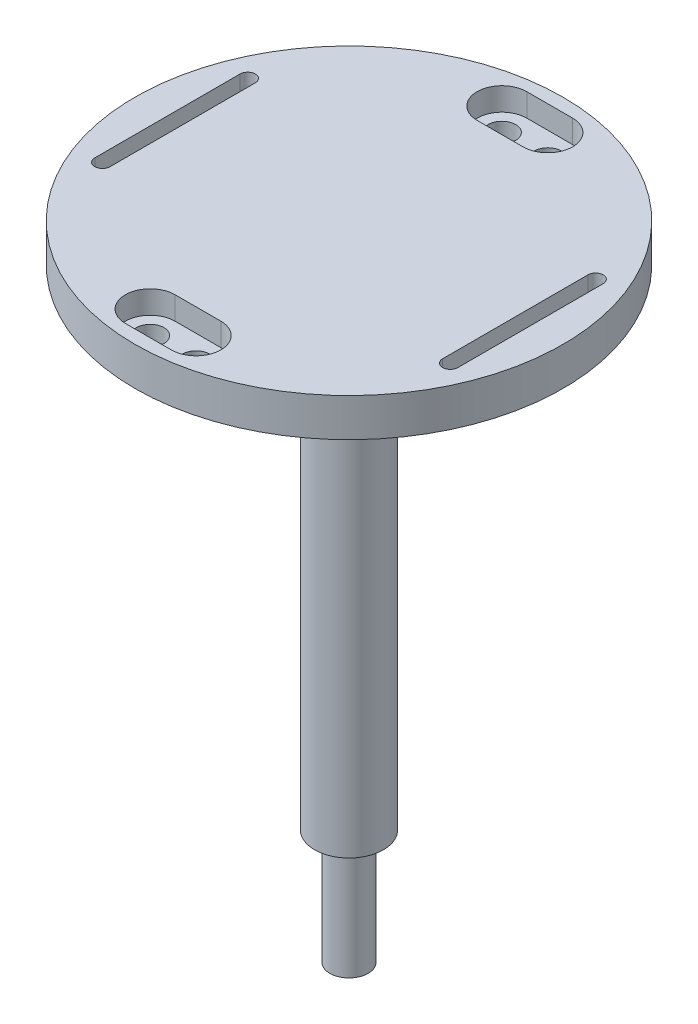
ISO-10303-21;
HEADER;
FILE_DESCRIPTION(('STEP AP214'),'2;1');
FILE_NAME('part.step','',(''),(''),'','','');
FILE_SCHEMA(('AUTOMOTIVE_DESIGN { 1 0 10303 214 1 1 1 1 }'));
ENDSEC;
DATA;
#1=APPLICATION_CONTEXT('core data for automotive mechanical design processes');
#2=APPLICATION_PROTOCOL_DEFINITION('international standard','automotive_design',2000,#1);
#3=PRODUCT_CONTEXT('',#1,'mechanical');
#4=PRODUCT('Part','Part','',(#3));
#5=PRODUCT_RELATED_PRODUCT_CATEGORY('part','',(#4));
#6=PRODUCT_DEFINITION_FORMATION('','',#4);
#7=PRODUCT_DEFINITION_CONTEXT('part definition',#1,'design');
#8=PRODUCT_DEFINITION('design','',#6,#7);
#9=PRODUCT_DEFINITION_SHAPE('','',#8);
#10=(LENGTH_UNIT() NAMED_UNIT(*) SI_UNIT(.MILLI.,.METRE.));
#11=(NAMED_UNIT(*) PLANE_ANGLE_UNIT() SI_UNIT($,.RADIAN.));
#12=(NAMED_UNIT(*) SI_UNIT($,.STERADIAN.) SOLID_ANGLE_UNIT());
#13=UNCERTAINTY_MEASURE_WITH_UNIT(LENGTH_MEASURE(1.E-05),#10,'distance_accuracy_value','');
#14=(GEOMETRIC_REPRESENTATION_CONTEXT(3) GLOBAL_UNCERTAINTY_ASSIGNED_CONTEXT((#13)) GLOBAL_UNIT_ASSIGNED_CONTEXT((#10,
#11,#12)) REPRESENTATION_CONTEXT('',''));
#15=CARTESIAN_POINT('',(0.,0.,0.));
#16=DIRECTION('',(0.,0.,1.));
#17=DIRECTION('',(1.,0.,0.));
#18=AXIS2_PLACEMENT_3D('',#15,#16,#17);
#19=CARTESIAN_POINT('',(0.,83.999999926,0.));
#20=DIRECTION('',(0.,1.,0.));
#21=DIRECTION('',(0.,0.,1.));
#22=AXIS2_PLACEMENT_3D('',#19,#20,#21);
#23=PLANE('',#22);
#24=CARTESIAN_POINT('',(-22.75,83.999999926,9.5));
#25=DIRECTION('',(0.,1.,0.));
#26=DIRECTION('',(0.,0.,1.));
#27=AXIS2_PLACEMENT_3D('',#24,#25,#26);
#28=CIRCLE('',#27,1.);
#29=CARTESIAN_POINT('',(-23.75,83.999999926,9.5));
#30=VERTEX_POINT('',#29);
#31=CARTESIAN_POINT('',(-21.75,83.999999926,9.5));
#32=VERTEX_POINT('',#31);
#33=EDGE_CURVE('E180',#30,#32,#28,.T.);
#34=ORIENTED_EDGE('',*,*,#33,.F.);
#35=DIRECTION('',(0.,0.,1.));
#36=VECTOR('',#35,1.);
#37=CARTESIAN_POINT('',(-23.75,83.999999926,9.5));
#38=LINE('',#37,#36);
#39=CARTESIAN_POINT('',(-23.75,83.999999926,-9.5));
#40=VERTEX_POINT('',#39);
#41=EDGE_CURVE('E195',#40,#30,#38,.T.);
#42=ORIENTED_EDGE('',*,*,#41,.F.);
#43=CARTESIAN_POINT('',(-22.75,83.999999926,-9.5));
#44=DIRECTION('',(0.,1.,0.));
#45=DIRECTION('',(0.,0.,1.));
#46=AXIS2_PLACEMENT_3D('',#43,#44,#45);
#47=CIRCLE('',#46,1.);
#48=CARTESIAN_POINT('',(-21.75,83.999999926,-9.5));
#49=VERTEX_POINT('',#48);
#50=EDGE_CURVE('E191',#49,#40,#47,.T.);
#51=ORIENTED_EDGE('',*,*,#50,.F.);
#52=DIRECTION('',(0.,0.,-1.));
#53=VECTOR('',#52,1.);
#54=CARTESIAN_POINT('',(-21.75,83.999999926,9.5));
#55=LINE('',#54,#53);
#56=EDGE_CURVE('E187',#32,#49,#55,.T.);
#57=ORIENTED_EDGE('',*,*,#56,.F.);
#58=EDGE_LOOP('',(#34,#42,#51,#57));
#59=FACE_BOUND('',#58,.T.);
#60=CARTESIAN_POINT('',(0.,83.999999926,0.));
#61=DIRECTION('',(0.,-1.,0.));
#62=DIRECTION('',(0.,0.,-1.));
#63=AXIS2_PLACEMENT_3D('',#60,#61,#62);
#64=CIRCLE('',#63,28.);
#65=CARTESIAN_POINT('',(0.,83.999999926,-28.));
#66=VERTEX_POINT('',#65);
#67=EDGE_CURVE('E348',#66,#66,#64,.T.);
#68=ORIENTED_EDGE('',*,*,#67,.F.);
#69=EDGE_LOOP('',(#68));
#70=FACE_BOUND('',#69,.T.);
#71=CARTESIAN_POINT('',(3.,83.999999926,23.));
#72=DIRECTION('',(0.,1.,0.));
#73=DIRECTION('',(0.,0.,1.));
#74=AXIS2_PLACEMENT_3D('',#71,#72,#73);
#75=CIRCLE('',#74,3.25);
#76=CARTESIAN_POINT('',(3.,83.999999926,26.25));
#77=VERTEX_POINT('',#76);
#78=CARTESIAN_POINT('',(3.,83.999999926,19.75));
#79=VERTEX_POINT('',#78);
#80=EDGE_CURVE('E307',#77,#79,#75,.T.);
#81=ORIENTED_EDGE('',*,*,#80,.F.);
#82=DIRECTION('',(1.,0.,0.));
#83=VECTOR('',#82,1.);
#84=CARTESIAN_POINT('',(-3.,83.999999926,26.25));
#85=LINE('',#84,#83);
#86=CARTESIAN_POINT('',(-3.,83.999999926,26.25));
#87=VERTEX_POINT('',#86);
#88=EDGE_CURVE('E243',#87,#77,#85,.T.);
#89=ORIENTED_EDGE('',*,*,#88,.F.);
#90=CARTESIAN_POINT('',(-3.,83.999999926,23.));
#91=DIRECTION('',(0.,1.,0.));
#92=DIRECTION('',(0.,0.,1.));
#93=AXIS2_PLACEMENT_3D('',#90,#91,#92);
#94=CIRCLE('',#93,3.25);
#95=CARTESIAN_POINT('',(-3.,83.999999926,19.75));
#96=VERTEX_POINT('',#95);
#97=EDGE_CURVE('E294',#96,#87,#94,.T.);
#98=ORIENTED_EDGE('',*,*,#97,.F.);
#99=DIRECTION('',(-1.,0.,0.));
#100=VECTOR('',#99,1.);
#101=CARTESIAN_POINT('',(-3.,83.999999926,19.75));
#102=LINE('',#101,#100);
#103=EDGE_CURVE('E246',#79,#96,#102,.T.);
#104=ORIENTED_EDGE('',*,*,#103,.F.);
#105=EDGE_LOOP('',(#81,#89,#98,#104));
#106=FACE_BOUND('',#105,.T.);
#107=CARTESIAN_POINT('',(3.,83.999999926,-23.));
#108=DIRECTION('',(0.,1.,0.));
#109=DIRECTION('',(0.,0.,1.));
#110=AXIS2_PLACEMENT_3D('',#107,#108,#109);
#111=CIRCLE('',#110,3.25);
#112=CARTESIAN_POINT('',(3.,83.999999926,-19.75));
#113=VERTEX_POINT('',#112);
#114=CARTESIAN_POINT('',(3.,83.999999926,-26.25));
#115=VERTEX_POINT('',#114);
#116=EDGE_CURVE('E242',#113,#115,#111,.T.);
#117=ORIENTED_EDGE('',*,*,#116,.F.);
#118=DIRECTION('',(1.,0.,0.));
#119=VECTOR('',#118,1.);
#120=CARTESIAN_POINT('',(-3.,83.999999926,-19.75));
#121=LINE('',#120,#119);
#122=CARTESIAN_POINT('',(-3.,83.999999926,-19.75));
#123=VERTEX_POINT('',#122);
#124=EDGE_CURVE('E213',#123,#113,#121,.T.);
#125=ORIENTED_EDGE('',*,*,#124,.F.);
#126=CARTESIAN_POINT('',(-3.,83.999999926,-23.));
#127=DIRECTION('',(0.,1.,0.));
#128=DIRECTION('',(0.,0.,1.));
#129=AXIS2_PLACEMENT_3D('',#126,#127,#128);
#130=CIRCLE('',#129,3.25);
#131=CARTESIAN_POINT('',(-3.,83.999999926,-26.25));
#132=VERTEX_POINT('',#131);
#133=EDGE_CURVE('E281',#132,#123,#130,.T.);
#134=ORIENTED_EDGE('',*,*,#133,.F.);
#135=DIRECTION('',(-1.,0.,0.));
#136=VECTOR('',#135,1.);
#137=CARTESIAN_POINT('',(-3.,83.999999926,-26.25));
#138=LINE('',#137,#136);
#139=EDGE_CURVE('E216',#115,#132,#138,.T.);
#140=ORIENTED_EDGE('',*,*,#139,.F.);
#141=EDGE_LOOP('',(#117,#125,#134,#140));
#142=FACE_BOUND('',#141,.T.);
#143=DIRECTION('',(0.,0.,1.));
#144=VECTOR('',#143,1.);
#145=CARTESIAN_POINT('',(23.75,83.999999926,9.5));
#146=LINE('',#145,#144);
#147=CARTESIAN_POINT('',(23.75,83.999999926,-9.5));
#148=VERTEX_POINT('',#147);
#149=CARTESIAN_POINT('',(23.75,83.999999926,9.5));
#150=VERTEX_POINT('',#149);
#151=EDGE_CURVE('E164',#148,#150,#146,.T.);
#152=ORIENTED_EDGE('',*,*,#151,.T.);
#153=CARTESIAN_POINT('',(22.75,83.999999926,9.5));
#154=DIRECTION('',(0.,-1.,0.));
#155=DIRECTION('',(0.,0.,1.));
#156=AXIS2_PLACEMENT_3D('',#153,#154,#155);
#157=CIRCLE('',#156,1.);
#158=CARTESIAN_POINT('',(21.75,83.999999926,9.5));
#159=VERTEX_POINT('',#158);
#160=EDGE_CURVE('E53',#150,#159,#157,.T.);
#161=ORIENTED_EDGE('',*,*,#160,.T.);
#162=DIRECTION('',(0.,0.,-1.));
#163=VECTOR('',#162,1.);
#164=CARTESIAN_POINT('',(21.75,83.999999926,9.5));
#165=LINE('',#164,#163);
#166=CARTESIAN_POINT('',(21.75,83.999999926,-9.5));
#167=VERTEX_POINT('',#166);
#168=EDGE_CURVE('E170',#159,#167,#165,.T.);
#169=ORIENTED_EDGE('',*,*,#168,.T.);
#170=CARTESIAN_POINT('',(22.75,83.999999926,-9.5));
#171=DIRECTION('',(0.,-1.,0.));
#172=DIRECTION('',(0.,0.,1.));
#173=AXIS2_PLACEMENT_3D('',#170,#171,#172);
#174=CIRCLE('',#173,1.);
#175=EDGE_CURVE('E154',#167,#148,#174,.T.);
#176=ORIENTED_EDGE('',*,*,#175,.T.);
#177=EDGE_LOOP('',(#152,#161,#169,#176));
#178=FACE_BOUND('',#177,.T.);
#179=ADVANCED_FACE('F38',(#59,#70,#106,#142,#178),#23,.T.);
#180=CARTESIAN_POINT('',(28.,78.999999926,0.));
#181=DIRECTION('',(0.,-1.,0.));
#182=DIRECTION('',(0.,0.,-1.));
#183=AXIS2_PLACEMENT_3D('',#180,#181,#182);
#184=PLANE('',#183);
#185=CARTESIAN_POINT('',(-22.75,78.999999926,9.5));
#186=DIRECTION('',(0.,-1.,0.));
#187=DIRECTION('',(0.,0.,-1.));
#188=AXIS2_PLACEMENT_3D('',#185,#186,#187);
#189=CIRCLE('',#188,1.);
#190=CARTESIAN_POINT('',(-21.75,78.999999926,9.5));
#191=VERTEX_POINT('',#190);
#192=CARTESIAN_POINT('',(-23.75,78.999999926,9.5));
#193=VERTEX_POINT('',#192);
#194=EDGE_CURVE('E374',#191,#193,#189,.T.);
#195=ORIENTED_EDGE('',*,*,#194,.F.);
#196=DIRECTION('',(0.,0.,1.));
#197=VECTOR('',#196,1.);
#198=CARTESIAN_POINT('',(-21.75,78.999999926,0.));
#199=LINE('',#198,#197);
#200=CARTESIAN_POINT('',(-21.75,78.999999926,-9.5));
#201=VERTEX_POINT('',#200);
#202=EDGE_CURVE('E352',#201,#191,#199,.T.);
#203=ORIENTED_EDGE('',*,*,#202,.F.);
#204=CARTESIAN_POINT('',(-22.75,78.999999926,-9.5));
#205=DIRECTION('',(0.,-1.,0.));
#206=DIRECTION('',(0.,0.,-1.));
#207=AXIS2_PLACEMENT_3D('',#204,#205,#206);
#208=CIRCLE('',#207,1.);
#209=CARTESIAN_POINT('',(-23.75,78.999999926,-9.5));
#210=VERTEX_POINT('',#209);
#211=EDGE_CURVE('E367',#210,#201,#208,.T.);
#212=ORIENTED_EDGE('',*,*,#211,.F.);
#213=DIRECTION('',(0.,0.,-1.));
#214=VECTOR('',#213,1.);
#215=CARTESIAN_POINT('',(-23.75,78.999999926,0.));
#216=LINE('',#215,#214);
#217=EDGE_CURVE('E371',#193,#210,#216,.T.);
#218=ORIENTED_EDGE('',*,*,#217,.F.);
#219=EDGE_LOOP('',(#195,#203,#212,#218));
#220=FACE_BOUND('',#219,.T.);
#221=CARTESIAN_POINT('',(3.,78.999999926,-23.));
#222=DIRECTION('',(0.,-1.,0.));
#223=DIRECTION('',(0.,0.,-1.));
#224=AXIS2_PLACEMENT_3D('',#221,#222,#223);
#225=CIRCLE('',#224,1.8);
#226=CARTESIAN_POINT('',(3.,78.999999926,-24.8));
#227=VERTEX_POINT('',#226);
#228=EDGE_CURVE('E280',#227,#227,#225,.T.);
#229=ORIENTED_EDGE('',*,*,#228,.F.);
#230=EDGE_LOOP('',(#229));
#231=FACE_BOUND('',#230,.T.);
#232=CARTESIAN_POINT('',(-3.,78.999999926,-23.));
#233=DIRECTION('',(0.,-1.,0.));
#234=DIRECTION('',(0.,0.,-1.));
#235=AXIS2_PLACEMENT_3D('',#232,#233,#234);
#236=CIRCLE('',#235,1.8);
#237=CARTESIAN_POINT('',(-3.,78.999999926,-24.8));
#238=VERTEX_POINT('',#237);
#239=EDGE_CURVE('E293',#238,#238,#236,.T.);
#240=ORIENTED_EDGE('',*,*,#239,.F.);
#241=EDGE_LOOP('',(#240));
#242=FACE_BOUND('',#241,.T.);
#243=CARTESIAN_POINT('',(-3.,78.999999926,23.));
#244=DIRECTION('',(0.,-1.,0.));
#245=DIRECTION('',(0.,0.,-1.));
#246=AXIS2_PLACEMENT_3D('',#243,#244,#245);
#247=CIRCLE('',#246,1.8);
#248=CARTESIAN_POINT('',(-3.,78.999999926,21.2));
#249=VERTEX_POINT('',#248);
#250=EDGE_CURVE('E306',#249,#249,#247,.T.);
#251=ORIENTED_EDGE('',*,*,#250,.F.);
#252=EDGE_LOOP('',(#251));
#253=FACE_BOUND('',#252,.T.);
#254=CARTESIAN_POINT('',(3.,78.999999926,23.));
#255=DIRECTION('',(0.,-1.,0.));
#256=DIRECTION('',(0.,0.,-1.));
#257=AXIS2_PLACEMENT_3D('',#254,#255,#256);
#258=CIRCLE('',#257,1.8);
#259=CARTESIAN_POINT('',(3.,78.999999926,21.2));
#260=VERTEX_POINT('',#259);
#261=EDGE_CURVE('E319',#260,#260,#258,.T.);
#262=ORIENTED_EDGE('',*,*,#261,.F.);
#263=EDGE_LOOP('',(#262));
#264=FACE_BOUND('',#263,.T.);
#265=CARTESIAN_POINT('',(0.,78.999999926,0.));
#266=DIRECTION('',(0.,-1.,0.));
#267=DIRECTION('',(0.,0.,-1.));
#268=AXIS2_PLACEMENT_3D('',#265,#266,#267);
#269=CIRCLE('',#268,28.);
#270=CARTESIAN_POINT('',(0.,78.999999926,-28.));
#271=VERTEX_POINT('',#270);
#272=EDGE_CURVE('E344',#271,#271,#269,.T.);
#273=ORIENTED_EDGE('',*,*,#272,.T.);
#274=EDGE_LOOP('',(#273));
#275=FACE_BOUND('',#274,.T.);
#276=CARTESIAN_POINT('',(0.,78.999999926,0.));
#277=DIRECTION('',(0.,-1.,0.));
#278=DIRECTION('',(0.,0.,-1.));
#279=AXIS2_PLACEMENT_3D('',#276,#277,#278);
#280=CIRCLE('',#279,15.);
#281=CARTESIAN_POINT('',(0.,78.999999926,-15.));
#282=VERTEX_POINT('',#281);
#283=EDGE_CURVE('E340',#282,#282,#280,.T.);
#284=ORIENTED_EDGE('',*,*,#283,.F.);
#285=EDGE_LOOP('',(#284));
#286=FACE_BOUND('',#285,.T.);
#287=DIRECTION('',(0.,0.,1.));
#288=VECTOR('',#287,1.);
#289=CARTESIAN_POINT('',(21.75,78.999999926,0.));
#290=LINE('',#289,#288);
#291=CARTESIAN_POINT('',(21.75,78.999999926,-9.5));
#292=VERTEX_POINT('',#291);
#293=CARTESIAN_POINT('',(21.75,78.999999926,9.5));
#294=VERTEX_POINT('',#293);
#295=EDGE_CURVE('E46',#292,#294,#290,.T.);
#296=ORIENTED_EDGE('',*,*,#295,.T.);
#297=CARTESIAN_POINT('',(22.75,78.999999926,9.5));
#298=DIRECTION('',(0.,-1.,0.));
#299=DIRECTION('',(0.,0.,-1.));
#300=AXIS2_PLACEMENT_3D('',#297,#298,#299);
#301=CIRCLE('',#300,1.);
#302=CARTESIAN_POINT('',(23.75,78.999999926,9.5));
#303=VERTEX_POINT('',#302);
#304=EDGE_CURVE('E11',#294,#303,#301,.F.);
#305=ORIENTED_EDGE('',*,*,#304,.T.);
#306=DIRECTION('',(0.,0.,-1.));
#307=VECTOR('',#306,1.);
#308=CARTESIAN_POINT('',(23.75,78.999999926,0.));
#309=LINE('',#308,#307);
#310=CARTESIAN_POINT('',(23.75,78.999999926,-9.5));
#311=VERTEX_POINT('',#310);
#312=EDGE_CURVE('E377',#303,#311,#309,.T.);
#313=ORIENTED_EDGE('',*,*,#312,.T.);
#314=CARTESIAN_POINT('',(22.75,78.999999926,-9.5));
#315=DIRECTION('',(0.,-1.,0.));
#316=DIRECTION('',(0.,0.,-1.));
#317=AXIS2_PLACEMENT_3D('',#314,#315,#316);
#318=CIRCLE('',#317,1.);
#319=EDGE_CURVE('E157',#311,#292,#318,.F.);
#320=ORIENTED_EDGE('',*,*,#319,.T.);
#321=EDGE_LOOP('',(#296,#305,#313,#320));
#322=FACE_BOUND('',#321,.T.);
#323=ADVANCED_FACE('F384',(#220,#231,#242,#253,#264,#275,#286,#322),#184,.T.);
#324=CARTESIAN_POINT('',(3.,83.999999926,23.));
#325=DIRECTION('',(0.,1.,0.));
#326=DIRECTION('',(0.,0.,1.));
#327=AXIS2_PLACEMENT_3D('',#324,#325,#326);
#328=CYLINDRICAL_SURFACE('',#327,3.25);
#329=DIRECTION('',(0.,-1.,0.));
#330=VECTOR('',#329,1.);
#331=CARTESIAN_POINT('',(3.,83.999999926,26.25));
#332=LINE('',#331,#330);
#333=CARTESIAN_POINT('',(3.,80.999999926,26.25));
#334=VERTEX_POINT('',#333);
#335=EDGE_CURVE('E262',#77,#334,#332,.T.);
#336=ORIENTED_EDGE('',*,*,#335,.F.);
#337=ORIENTED_EDGE('',*,*,#80,.T.);
#338=DIRECTION('',(0.,-1.,0.));
#339=VECTOR('',#338,1.);
#340=CARTESIAN_POINT('',(3.,83.999999926,19.75));
#341=LINE('',#340,#339);
#342=CARTESIAN_POINT('',(3.,80.999999926,19.75));
#343=VERTEX_POINT('',#342);
#344=EDGE_CURVE('E258',#79,#343,#341,.T.);
#345=ORIENTED_EDGE('',*,*,#344,.T.);
#346=CARTESIAN_POINT('',(3.,80.999999926,23.));
#347=DIRECTION('',(0.,1.,0.));
#348=DIRECTION('',(0.,0.,1.));
#349=AXIS2_PLACEMENT_3D('',#346,#347,#348);
#350=CIRCLE('',#349,3.25);
#351=EDGE_CURVE('E311',#334,#343,#350,.T.);
#352=ORIENTED_EDGE('',*,*,#351,.F.);
#353=EDGE_LOOP('',(#336,#337,#345,#352));
#354=FACE_BOUND('',#353,.T.);
#355=ADVANCED_FACE('F408',(#354),#328,.F.);
#356=CARTESIAN_POINT('',(-3.,83.999999926,23.));
#357=DIRECTION('',(0.,1.,0.));
#358=DIRECTION('',(0.,0.,1.));
#359=AXIS2_PLACEMENT_3D('',#356,#357,#358);
#360=CYLINDRICAL_SURFACE('',#359,3.25);
#361=ORIENTED_EDGE('',*,*,#97,.T.);
#362=DIRECTION('',(0.,-1.,0.));
#363=VECTOR('',#362,1.);
#364=CARTESIAN_POINT('',(-3.,83.999999926,26.25));
#365=LINE('',#364,#363);
#366=CARTESIAN_POINT('',(-3.,80.999999926,26.25));
#367=VERTEX_POINT('',#366);
#368=EDGE_CURVE('E225',#87,#367,#365,.T.);
#369=ORIENTED_EDGE('',*,*,#368,.T.);
#370=CARTESIAN_POINT('',(-3.,80.999999926,23.));
#371=DIRECTION('',(0.,1.,0.));
#372=DIRECTION('',(0.,0.,1.));
#373=AXIS2_PLACEMENT_3D('',#370,#371,#372);
#374=CIRCLE('',#373,3.25);
#375=CARTESIAN_POINT('',(-3.,80.999999926,19.75));
#376=VERTEX_POINT('',#375);
#377=EDGE_CURVE('E298',#376,#367,#374,.T.);
#378=ORIENTED_EDGE('',*,*,#377,.F.);
#379=DIRECTION('',(0.,-1.,0.));
#380=VECTOR('',#379,1.);
#381=CARTESIAN_POINT('',(-3.,83.999999926,19.75));
#382=LINE('',#381,#380);
#383=EDGE_CURVE('E250',#96,#376,#382,.T.);
#384=ORIENTED_EDGE('',*,*,#383,.F.);
#385=EDGE_LOOP('',(#361,#369,#378,#384));
#386=FACE_BOUND('',#385,.T.);
#387=ADVANCED_FACE('F466',(#386),#360,.F.);
#388=CARTESIAN_POINT('',(-3.,83.999999926,-23.));
#389=DIRECTION('',(0.,1.,0.));
#390=DIRECTION('',(0.,0.,1.));
#391=AXIS2_PLACEMENT_3D('',#388,#389,#390);
#392=CYLINDRICAL_SURFACE('',#391,3.25);
#393=ORIENTED_EDGE('',*,*,#133,.T.);
#394=DIRECTION('',(0.,-1.,0.));
#395=VECTOR('',#394,1.);
#396=CARTESIAN_POINT('',(-3.,83.999999926,-19.75));
#397=LINE('',#396,#395);
#398=CARTESIAN_POINT('',(-3.,80.999999926,-19.75));
#399=VERTEX_POINT('',#398);
#400=EDGE_CURVE('E238',#123,#399,#397,.T.);
#401=ORIENTED_EDGE('',*,*,#400,.T.);
#402=CARTESIAN_POINT('',(-3.,80.999999926,-23.));
#403=DIRECTION('',(0.,1.,0.));
#404=DIRECTION('',(0.,0.,1.));
#405=AXIS2_PLACEMENT_3D('',#402,#403,#404);
#406=CIRCLE('',#405,3.25);
#407=CARTESIAN_POINT('',(-3.,80.999999926,-26.25));
#408=VERTEX_POINT('',#407);
#409=EDGE_CURVE('E285',#408,#399,#406,.T.);
#410=ORIENTED_EDGE('',*,*,#409,.F.);
#411=DIRECTION('',(0.,-1.,0.));
#412=VECTOR('',#411,1.);
#413=CARTESIAN_POINT('',(-3.,83.999999926,-26.25));
#414=LINE('',#413,#412);
#415=EDGE_CURVE('E220',#132,#408,#414,.T.);
#416=ORIENTED_EDGE('',*,*,#415,.F.);
#417=EDGE_LOOP('',(#393,#401,#410,#416));
#418=FACE_BOUND('',#417,.T.);
#419=ADVANCED_FACE('F437',(#418),#392,.F.);
#420=CARTESIAN_POINT('',(3.,83.999999926,-23.));
#421=DIRECTION('',(0.,1.,0.));
#422=DIRECTION('',(0.,0.,1.));
#423=AXIS2_PLACEMENT_3D('',#420,#421,#422);
#424=CYLINDRICAL_SURFACE('',#423,3.25);
#425=DIRECTION('',(0.,-1.,0.));
#426=VECTOR('',#425,1.);
#427=CARTESIAN_POINT('',(3.,83.999999926,-19.75));
#428=LINE('',#427,#426);
#429=CARTESIAN_POINT('',(3.,80.999999926,-19.75));
#430=VERTEX_POINT('',#429);
#431=EDGE_CURVE('E235',#113,#430,#428,.T.);
#432=ORIENTED_EDGE('',*,*,#431,.F.);
#433=ORIENTED_EDGE('',*,*,#116,.T.);
#434=DIRECTION('',(0.,-1.,0.));
#435=VECTOR('',#434,1.);
#436=CARTESIAN_POINT('',(3.,83.999999926,-26.25));
#437=LINE('',#436,#435);
#438=CARTESIAN_POINT('',(3.,80.999999926,-26.25));
#439=VERTEX_POINT('',#438);
#440=EDGE_CURVE('E231',#115,#439,#437,.T.);
#441=ORIENTED_EDGE('',*,*,#440,.T.);
#442=CARTESIAN_POINT('',(3.,80.999999926,-23.));
#443=DIRECTION('',(0.,1.,0.));
#444=DIRECTION('',(0.,0.,1.));
#445=AXIS2_PLACEMENT_3D('',#442,#443,#444);
#446=CIRCLE('',#445,3.25);
#447=EDGE_CURVE('E272',#430,#439,#446,.T.);
#448=ORIENTED_EDGE('',*,*,#447,.F.);
#449=EDGE_LOOP('',(#432,#433,#441,#448));
#450=FACE_BOUND('',#449,.T.);
#451=ADVANCED_FACE('F427',(#450),#424,.F.);
#452=CARTESIAN_POINT('',(0.,0.,0.));
#453=DIRECTION('',(0.,-1.,0.));
#454=DIRECTION('',(0.,0.,-1.));
#455=AXIS2_PLACEMENT_3D('',#452,#453,#454);
#456=CYLINDRICAL_SURFACE('',#455,28.);
#457=ORIENTED_EDGE('',*,*,#67,.T.);
#458=EDGE_LOOP('',(#457));
#459=FACE_BOUND('',#458,.T.);
#460=ORIENTED_EDGE('',*,*,#272,.F.);
#461=EDGE_LOOP('',(#460));
#462=FACE_BOUND('',#461,.T.);
#463=ADVANCED_FACE('F462',(#459,#462),#456,.T.);
#464=CARTESIAN_POINT('',(0.,0.,0.));
#465=DIRECTION('',(0.,-1.,0.));
#466=DIRECTION('',(0.,0.,-1.));
#467=AXIS2_PLACEMENT_3D('',#464,#465,#466);
#468=CYLINDRICAL_SURFACE('',#467,15.);
#469=ORIENTED_EDGE('',*,*,#283,.T.);
#470=EDGE_LOOP('',(#469));
#471=FACE_BOUND('',#470,.T.);
#472=CARTESIAN_POINT('',(0.,79.999999926,0.));
#473=DIRECTION('',(0.,-1.,0.));
#474=DIRECTION('',(0.,0.,-1.));
#475=AXIS2_PLACEMENT_3D('',#472,#473,#474);
#476=CIRCLE('',#475,15.);
#477=CARTESIAN_POINT('',(0.,79.999999926,-15.));
#478=VERTEX_POINT('',#477);
#479=EDGE_CURVE('E336',#478,#478,#476,.T.);
#480=ORIENTED_EDGE('',*,*,#479,.F.);
#481=EDGE_LOOP('',(#480));
#482=FACE_BOUND('',#481,.T.);
#483=ADVANCED_FACE('F510',(#471,#482),#468,.F.);
#484=CARTESIAN_POINT('',(15.,79.999999926,0.));
#485=DIRECTION('',(0.,-1.,0.));
#486=DIRECTION('',(0.,0.,-1.));
#487=AXIS2_PLACEMENT_3D('',#484,#485,#486);
#488=PLANE('',#487);
#489=ORIENTED_EDGE('',*,*,#479,.T.);
#490=EDGE_LOOP('',(#489));
#491=FACE_BOUND('',#490,.T.);
#492=CARTESIAN_POINT('',(0.,79.999999926,0.));
#493=DIRECTION('',(0.,-1.,0.));
#494=DIRECTION('',(0.,0.,-1.));
#495=AXIS2_PLACEMENT_3D('',#492,#493,#494);
#496=CIRCLE('',#495,4.5);
#497=CARTESIAN_POINT('',(0.,79.999999926,-4.5));
#498=VERTEX_POINT('',#497);
#499=EDGE_CURVE('E332',#498,#498,#496,.T.);
#500=ORIENTED_EDGE('',*,*,#499,.F.);
#501=EDGE_LOOP('',(#500));
#502=FACE_BOUND('',#501,.T.);
#503=ADVANCED_FACE('F506',(#491,#502),#488,.T.);
#504=CARTESIAN_POINT('',(0.,0.,0.));
#505=DIRECTION('',(0.,-1.,0.));
#506=DIRECTION('',(0.,0.,-1.));
#507=AXIS2_PLACEMENT_3D('',#504,#505,#506);
#508=CYLINDRICAL_SURFACE('',#507,4.5);
#509=ORIENTED_EDGE('',*,*,#499,.T.);
#510=EDGE_LOOP('',(#509));
#511=FACE_BOUND('',#510,.T.);
#512=CARTESIAN_POINT('',(0.,15.,0.));
#513=DIRECTION('',(0.,-1.,0.));
#514=DIRECTION('',(0.,0.,-1.));
#515=AXIS2_PLACEMENT_3D('',#512,#513,#514);
#516=CIRCLE('',#515,4.50000000000001);
#517=CARTESIAN_POINT('',(0.,15.,-4.50000000000001));
#518=VERTEX_POINT('',#517);
#519=EDGE_CURVE('E328',#518,#518,#516,.T.);
#520=ORIENTED_EDGE('',*,*,#519,.F.);
#521=EDGE_LOOP('',(#520));
#522=FACE_BOUND('',#521,.T.);
#523=ADVANCED_FACE('F502',(#511,#522),#508,.T.);
#524=CARTESIAN_POINT('',(4.50000000000001,15.,0.));
#525=DIRECTION('',(0.,-1.,0.));
#526=DIRECTION('',(0.,0.,-1.));
#527=AXIS2_PLACEMENT_3D('',#524,#525,#526);
#528=PLANE('',#527);
#529=ORIENTED_EDGE('',*,*,#519,.T.);
#530=EDGE_LOOP('',(#529));
#531=FACE_BOUND('',#530,.T.);
#532=CARTESIAN_POINT('',(0.,15.,0.));
#533=DIRECTION('',(0.,-1.,0.));
#534=DIRECTION('',(0.,0.,-1.));
#535=AXIS2_PLACEMENT_3D('',#532,#533,#534);
#536=CIRCLE('',#535,2.5);
#537=CARTESIAN_POINT('',(0.,15.,-2.5));
#538=VERTEX_POINT('',#537);
#539=EDGE_CURVE('E324',#538,#538,#536,.T.);
#540=ORIENTED_EDGE('',*,*,#539,.F.);
#541=EDGE_LOOP('',(#540));
#542=FACE_BOUND('',#541,.T.);
#543=ADVANCED_FACE('F498',(#531,#542),#528,.T.);
#544=CARTESIAN_POINT('',(0.,0.,0.));
#545=DIRECTION('',(0.,-1.,0.));
#546=DIRECTION('',(0.,0.,-1.));
#547=AXIS2_PLACEMENT_3D('',#544,#545,#546);
#548=CYLINDRICAL_SURFACE('',#547,2.5);
#549=ORIENTED_EDGE('',*,*,#539,.T.);
#550=EDGE_LOOP('',(#549));
#551=FACE_BOUND('',#550,.T.);
#552=CARTESIAN_POINT('',(0.,0.,0.));
#553=DIRECTION('',(0.,-1.,0.));
#554=DIRECTION('',(0.,0.,-1.));
#555=AXIS2_PLACEMENT_3D('',#552,#553,#554);
#556=CIRCLE('',#555,2.50000000000001);
#557=CARTESIAN_POINT('',(0.,0.,-2.50000000000001));
#558=VERTEX_POINT('',#557);
#559=EDGE_CURVE('E320',#558,#558,#556,.T.);
#560=ORIENTED_EDGE('',*,*,#559,.F.);
#561=EDGE_LOOP('',(#560));
#562=FACE_BOUND('',#561,.T.);
#563=ADVANCED_FACE('F494',(#551,#562),#548,.T.);
#564=CARTESIAN_POINT('',(2.50000000000001,0.,0.));
#565=DIRECTION('',(0.,-1.,0.));
#566=DIRECTION('',(0.,0.,-1.));
#567=AXIS2_PLACEMENT_3D('',#564,#565,#566);
#568=PLANE('',#567);
#569=ORIENTED_EDGE('',*,*,#559,.T.);
#570=EDGE_LOOP('',(#569));
#571=FACE_BOUND('',#570,.T.);
#572=ADVANCED_FACE('F490',(#571),#568,.T.);
#573=CARTESIAN_POINT('',(3.,83.999999926,23.));
#574=DIRECTION('',(0.,1.,0.));
#575=DIRECTION('',(0.,0.,1.));
#576=AXIS2_PLACEMENT_3D('',#573,#574,#575);
#577=CYLINDRICAL_SURFACE('',#576,1.8);
#578=ORIENTED_EDGE('',*,*,#261,.T.);
#579=EDGE_LOOP('',(#578));
#580=FACE_BOUND('',#579,.T.);
#581=CARTESIAN_POINT('',(3.,80.999999926,23.));
#582=DIRECTION('',(0.,1.,0.));
#583=DIRECTION('',(0.,0.,1.));
#584=AXIS2_PLACEMENT_3D('',#581,#582,#583);
#585=CIRCLE('',#584,1.8);
#586=CARTESIAN_POINT('',(3.,80.999999926,24.8));
#587=VERTEX_POINT('',#586);
#588=EDGE_CURVE('E315',#587,#587,#585,.T.);
#589=ORIENTED_EDGE('',*,*,#588,.T.);
#590=EDGE_LOOP('',(#589));
#591=FACE_BOUND('',#590,.T.);
#592=ADVANCED_FACE('F486',(#580,#591),#577,.F.);
#593=CARTESIAN_POINT('',(4.8,80.999999926,23.));
#594=DIRECTION('',(0.,-1.,0.));
#595=DIRECTION('',(0.,0.,-1.));
#596=AXIS2_PLACEMENT_3D('',#593,#594,#595);
#597=PLANE('',#596);
#598=DIRECTION('',(1.,0.,0.));
#599=VECTOR('',#598,1.);
#600=CARTESIAN_POINT('',(-3.,80.999999926,26.25));
#601=LINE('',#600,#599);
#602=EDGE_CURVE('E203',#367,#334,#601,.T.);
#603=ORIENTED_EDGE('',*,*,#602,.T.);
#604=ORIENTED_EDGE('',*,*,#351,.T.);
#605=DIRECTION('',(-1.,0.,0.));
#606=VECTOR('',#605,1.);
#607=CARTESIAN_POINT('',(-3.,80.999999926,19.75));
#608=LINE('',#607,#606);
#609=EDGE_CURVE('E247',#343,#376,#608,.T.);
#610=ORIENTED_EDGE('',*,*,#609,.T.);
#611=ORIENTED_EDGE('',*,*,#377,.T.);
#612=EDGE_LOOP('',(#603,#604,#610,#611));
#613=FACE_BOUND('',#612,.T.);
#614=ORIENTED_EDGE('',*,*,#588,.F.);
#615=EDGE_LOOP('',(#614));
#616=FACE_BOUND('',#615,.T.);
#617=CARTESIAN_POINT('',(-3.,80.999999926,23.));
#618=DIRECTION('',(0.,1.,0.));
#619=DIRECTION('',(0.,0.,1.));
#620=AXIS2_PLACEMENT_3D('',#617,#618,#619);
#621=CIRCLE('',#620,1.8);
#622=CARTESIAN_POINT('',(-3.,80.999999926,24.8));
#623=VERTEX_POINT('',#622);
#624=EDGE_CURVE('E302',#623,#623,#621,.T.);
#625=ORIENTED_EDGE('',*,*,#624,.F.);
#626=EDGE_LOOP('',(#625));
#627=FACE_BOUND('',#626,.T.);
#628=ADVANCED_FACE('F479',(#613,#616,#627),#597,.F.);
#629=CARTESIAN_POINT('',(-3.,83.999999926,23.));
#630=DIRECTION('',(0.,1.,0.));
#631=DIRECTION('',(0.,0.,1.));
#632=AXIS2_PLACEMENT_3D('',#629,#630,#631);
#633=CYLINDRICAL_SURFACE('',#632,1.8);
#634=ORIENTED_EDGE('',*,*,#250,.T.);
#635=EDGE_LOOP('',(#634));
#636=FACE_BOUND('',#635,.T.);
#637=ORIENTED_EDGE('',*,*,#624,.T.);
#638=EDGE_LOOP('',(#637));
#639=FACE_BOUND('',#638,.T.);
#640=ADVANCED_FACE('F472',(#636,#639),#633,.F.);
#641=CARTESIAN_POINT('',(-3.,83.999999926,-23.));
#642=DIRECTION('',(0.,1.,0.));
#643=DIRECTION('',(0.,0.,1.));
#644=AXIS2_PLACEMENT_3D('',#641,#642,#643);
#645=CYLINDRICAL_SURFACE('',#644,1.8);
#646=ORIENTED_EDGE('',*,*,#239,.T.);
#647=EDGE_LOOP('',(#646));
#648=FACE_BOUND('',#647,.T.);
#649=CARTESIAN_POINT('',(-3.,80.999999926,-23.));
#650=DIRECTION('',(0.,1.,0.));
#651=DIRECTION('',(0.,0.,1.));
#652=AXIS2_PLACEMENT_3D('',#649,#650,#651);
#653=CIRCLE('',#652,1.8);
#654=CARTESIAN_POINT('',(-3.,80.999999926,-21.2));
#655=VERTEX_POINT('',#654);
#656=EDGE_CURVE('E289',#655,#655,#653,.T.);
#657=ORIENTED_EDGE('',*,*,#656,.T.);
#658=EDGE_LOOP('',(#657));
#659=FACE_BOUND('',#658,.T.);
#660=ADVANCED_FACE('F469',(#648,#659),#645,.F.);
#661=CARTESIAN_POINT('',(-1.2,80.999999926,-23.));
#662=DIRECTION('',(0.,-1.,0.));
#663=DIRECTION('',(0.,0.,-1.));
#664=AXIS2_PLACEMENT_3D('',#661,#662,#663);
#665=PLANE('',#664);
#666=DIRECTION('',(-1.,0.,0.));
#667=VECTOR('',#666,1.);
#668=CARTESIAN_POINT('',(-3.,80.999999926,-26.25));
#669=LINE('',#668,#667);
#670=EDGE_CURVE('E217',#439,#408,#669,.T.);
#671=ORIENTED_EDGE('',*,*,#670,.T.);
#672=ORIENTED_EDGE('',*,*,#409,.T.);
#673=DIRECTION('',(1.,0.,0.));
#674=VECTOR('',#673,1.);
#675=CARTESIAN_POINT('',(-3.,80.999999926,-19.75));
#676=LINE('',#675,#674);
#677=EDGE_CURVE('E221',#399,#430,#676,.T.);
#678=ORIENTED_EDGE('',*,*,#677,.T.);
#679=ORIENTED_EDGE('',*,*,#447,.T.);
#680=EDGE_LOOP('',(#671,#672,#678,#679));
#681=FACE_BOUND('',#680,.T.);
#682=ORIENTED_EDGE('',*,*,#656,.F.);
#683=EDGE_LOOP('',(#682));
#684=FACE_BOUND('',#683,.T.);
#685=CARTESIAN_POINT('',(3.,80.999999926,-23.));
#686=DIRECTION('',(0.,1.,0.));
#687=DIRECTION('',(0.,0.,1.));
#688=AXIS2_PLACEMENT_3D('',#685,#686,#687);
#689=CIRCLE('',#688,1.8);
#690=CARTESIAN_POINT('',(3.,80.999999926,-21.2));
#691=VERTEX_POINT('',#690);
#692=EDGE_CURVE('E276',#691,#691,#689,.T.);
#693=ORIENTED_EDGE('',*,*,#692,.F.);
#694=EDGE_LOOP('',(#693));
#695=FACE_BOUND('',#694,.T.);
#696=ADVANCED_FACE('F432',(#681,#684,#695),#665,.F.);
#697=CARTESIAN_POINT('',(3.,83.999999926,-23.));
#698=DIRECTION('',(0.,1.,0.));
#699=DIRECTION('',(0.,0.,1.));
#700=AXIS2_PLACEMENT_3D('',#697,#698,#699);
#701=CYLINDRICAL_SURFACE('',#700,1.8);
#702=ORIENTED_EDGE('',*,*,#228,.T.);
#703=EDGE_LOOP('',(#702));
#704=FACE_BOUND('',#703,.T.);
#705=ORIENTED_EDGE('',*,*,#692,.T.);
#706=EDGE_LOOP('',(#705));
#707=FACE_BOUND('',#706,.T.);
#708=ADVANCED_FACE('F441',(#704,#707),#701,.F.);
#709=CARTESIAN_POINT('',(-3.,83.999999926,-26.25));
#710=DIRECTION('',(0.,0.,1.));
#711=DIRECTION('',(1.,0.,0.));
#712=AXIS2_PLACEMENT_3D('',#709,#710,#711);
#713=PLANE('',#712);
#714=ORIENTED_EDGE('',*,*,#670,.F.);
#715=ORIENTED_EDGE('',*,*,#440,.F.);
#716=ORIENTED_EDGE('',*,*,#139,.T.);
#717=ORIENTED_EDGE('',*,*,#415,.T.);
#718=EDGE_LOOP('',(#714,#715,#716,#717));
#719=FACE_BOUND('',#718,.T.);
#720=ADVANCED_FACE('F439',(#719),#713,.T.);
#721=CARTESIAN_POINT('',(-3.,83.999999926,-19.75));
#722=DIRECTION('',(0.,0.,-1.));
#723=DIRECTION('',(-1.,0.,0.));
#724=AXIS2_PLACEMENT_3D('',#721,#722,#723);
#725=PLANE('',#724);
#726=ORIENTED_EDGE('',*,*,#677,.F.);
#727=ORIENTED_EDGE('',*,*,#400,.F.);
#728=ORIENTED_EDGE('',*,*,#124,.T.);
#729=ORIENTED_EDGE('',*,*,#431,.T.);
#730=EDGE_LOOP('',(#726,#727,#728,#729));
#731=FACE_BOUND('',#730,.T.);
#732=ADVANCED_FACE('F430',(#731),#725,.T.);
#733=CARTESIAN_POINT('',(-3.,83.999999926,26.25));
#734=DIRECTION('',(0.,0.,-1.));
#735=DIRECTION('',(-1.,0.,0.));
#736=AXIS2_PLACEMENT_3D('',#733,#734,#735);
#737=PLANE('',#736);
#738=ORIENTED_EDGE('',*,*,#602,.F.);
#739=ORIENTED_EDGE('',*,*,#368,.F.);
#740=ORIENTED_EDGE('',*,*,#88,.T.);
#741=ORIENTED_EDGE('',*,*,#335,.T.);
#742=EDGE_LOOP('',(#738,#739,#740,#741));
#743=FACE_BOUND('',#742,.T.);
#744=ADVANCED_FACE('F447',(#743),#737,.T.);
#745=CARTESIAN_POINT('',(-3.,83.999999926,19.75));
#746=DIRECTION('',(0.,0.,1.));
#747=DIRECTION('',(1.,0.,0.));
#748=AXIS2_PLACEMENT_3D('',#745,#746,#747);
#749=PLANE('',#748);
#750=ORIENTED_EDGE('',*,*,#609,.F.);
#751=ORIENTED_EDGE('',*,*,#344,.F.);
#752=ORIENTED_EDGE('',*,*,#103,.T.);
#753=ORIENTED_EDGE('',*,*,#383,.T.);
#754=EDGE_LOOP('',(#750,#751,#752,#753));
#755=FACE_BOUND('',#754,.T.);
#756=ADVANCED_FACE('F454',(#755),#749,.T.);
#757=CARTESIAN_POINT('',(-22.75,0.,9.5));
#758=DIRECTION('',(0.,1.,0.));
#759=DIRECTION('',(0.,0.,1.));
#760=AXIS2_PLACEMENT_3D('',#757,#758,#759);
#761=CYLINDRICAL_SURFACE('',#760,1.);
#762=ORIENTED_EDGE('',*,*,#194,.T.);
#763=DIRECTION('',(0.,1.,0.));
#764=VECTOR('',#763,1.);
#765=CARTESIAN_POINT('',(-23.75,0.,9.5));
#766=LINE('',#765,#764);
#767=EDGE_CURVE('E200',#193,#30,#766,.T.);
#768=ORIENTED_EDGE('',*,*,#767,.T.);
#769=ORIENTED_EDGE('',*,*,#33,.T.);
#770=DIRECTION('',(0.,1.,0.));
#771=VECTOR('',#770,1.);
#772=CARTESIAN_POINT('',(-21.75,0.,9.5));
#773=LINE('',#772,#771);
#774=EDGE_CURVE('E199',#191,#32,#773,.T.);
#775=ORIENTED_EDGE('',*,*,#774,.F.);
#776=EDGE_LOOP('',(#762,#768,#769,#775));
#777=FACE_BOUND('',#776,.T.);
#778=ADVANCED_FACE('F452',(#777),#761,.F.);
#779=CARTESIAN_POINT('',(-23.75,0.,9.5));
#780=DIRECTION('',(-1.,0.,0.));
#781=DIRECTION('',(0.,0.,1.));
#782=AXIS2_PLACEMENT_3D('',#779,#780,#781);
#783=PLANE('',#782);
#784=ORIENTED_EDGE('',*,*,#217,.T.);
#785=DIRECTION('',(0.,1.,0.));
#786=VECTOR('',#785,1.);
#787=CARTESIAN_POINT('',(-23.75,0.,-9.5));
#788=LINE('',#787,#786);
#789=EDGE_CURVE('E204',#210,#40,#788,.T.);
#790=ORIENTED_EDGE('',*,*,#789,.T.);
#791=ORIENTED_EDGE('',*,*,#41,.T.);
#792=ORIENTED_EDGE('',*,*,#767,.F.);
#793=EDGE_LOOP('',(#784,#790,#791,#792));
#794=FACE_BOUND('',#793,.T.);
#795=ADVANCED_FACE('F646',(#794),#783,.F.);
#796=CARTESIAN_POINT('',(-22.75,0.,-9.5));
#797=DIRECTION('',(0.,1.,0.));
#798=DIRECTION('',(0.,0.,1.));
#799=AXIS2_PLACEMENT_3D('',#796,#797,#798);
#800=CYLINDRICAL_SURFACE('',#799,1.);
#801=ORIENTED_EDGE('',*,*,#211,.T.);
#802=DIRECTION('',(0.,1.,0.));
#803=VECTOR('',#802,1.);
#804=CARTESIAN_POINT('',(-21.75,0.,-9.5));
#805=LINE('',#804,#803);
#806=EDGE_CURVE('E207',#201,#49,#805,.T.);
#807=ORIENTED_EDGE('',*,*,#806,.T.);
#808=ORIENTED_EDGE('',*,*,#50,.T.);
#809=ORIENTED_EDGE('',*,*,#789,.F.);
#810=EDGE_LOOP('',(#801,#807,#808,#809));
#811=FACE_BOUND('',#810,.T.);
#812=ADVANCED_FACE('F397',(#811),#800,.F.);
#813=CARTESIAN_POINT('',(-21.75,0.,9.5));
#814=DIRECTION('',(1.,0.,0.));
#815=DIRECTION('',(0.,0.,-1.));
#816=AXIS2_PLACEMENT_3D('',#813,#814,#815);
#817=PLANE('',#816);
#818=ORIENTED_EDGE('',*,*,#202,.T.);
#819=ORIENTED_EDGE('',*,*,#774,.T.);
#820=ORIENTED_EDGE('',*,*,#56,.T.);
#821=ORIENTED_EDGE('',*,*,#806,.F.);
#822=EDGE_LOOP('',(#818,#819,#820,#821));
#823=FACE_BOUND('',#822,.T.);
#824=ADVANCED_FACE('F390',(#823),#817,.F.);
#825=CARTESIAN_POINT('',(22.75,0.,9.5));
#826=DIRECTION('',(0.,1.,0.));
#827=DIRECTION('',(0.,0.,1.));
#828=AXIS2_PLACEMENT_3D('',#825,#826,#827);
#829=CYLINDRICAL_SURFACE('',#828,1.);
#830=DIRECTION('',(0.,1.,0.));
#831=VECTOR('',#830,1.);
#832=CARTESIAN_POINT('',(21.75,0.,9.5));
#833=LINE('',#832,#831);
#834=EDGE_CURVE('E177',#294,#159,#833,.T.);
#835=ORIENTED_EDGE('',*,*,#834,.T.);
#836=ORIENTED_EDGE('',*,*,#160,.F.);
#837=DIRECTION('',(0.,1.,0.));
#838=VECTOR('',#837,1.);
#839=CARTESIAN_POINT('',(23.75,0.,9.5));
#840=LINE('',#839,#838);
#841=EDGE_CURVE('E161',#303,#150,#840,.T.);
#842=ORIENTED_EDGE('',*,*,#841,.F.);
#843=ORIENTED_EDGE('',*,*,#304,.F.);
#844=EDGE_LOOP('',(#835,#836,#842,#843));
#845=FACE_BOUND('',#844,.T.);
#846=ADVANCED_FACE('F388',(#845),#829,.F.);
#847=CARTESIAN_POINT('',(21.75,0.,9.5));
#848=DIRECTION('',(1.,0.,0.));
#849=DIRECTION('',(0.,0.,-1.));
#850=AXIS2_PLACEMENT_3D('',#847,#848,#849);
#851=PLANE('',#850);
#852=DIRECTION('',(0.,1.,0.));
#853=VECTOR('',#852,1.);
#854=CARTESIAN_POINT('',(21.75,0.,-9.5));
#855=LINE('',#854,#853);
#856=EDGE_CURVE('E160',#292,#167,#855,.T.);
#857=ORIENTED_EDGE('',*,*,#856,.T.);
#858=ORIENTED_EDGE('',*,*,#168,.F.);
#859=ORIENTED_EDGE('',*,*,#834,.F.);
#860=ORIENTED_EDGE('',*,*,#295,.F.);
#861=EDGE_LOOP('',(#857,#858,#859,#860));
#862=FACE_BOUND('',#861,.T.);
#863=ADVANCED_FACE('F387',(#862),#851,.T.);
#864=CARTESIAN_POINT('',(22.75,0.,-9.5));
#865=DIRECTION('',(0.,1.,0.));
#866=DIRECTION('',(0.,0.,1.));
#867=AXIS2_PLACEMENT_3D('',#864,#865,#866);
#868=CYLINDRICAL_SURFACE('',#867,1.);
#869=DIRECTION('',(0.,1.,0.));
#870=VECTOR('',#869,1.);
#871=CARTESIAN_POINT('',(23.75,0.,-9.5));
#872=LINE('',#871,#870);
#873=EDGE_CURVE('E61',#311,#148,#872,.T.);
#874=ORIENTED_EDGE('',*,*,#873,.T.);
#875=ORIENTED_EDGE('',*,*,#175,.F.);
#876=ORIENTED_EDGE('',*,*,#856,.F.);
#877=ORIENTED_EDGE('',*,*,#319,.F.);
#878=EDGE_LOOP('',(#874,#875,#876,#877));
#879=FACE_BOUND('',#878,.T.);
#880=ADVANCED_FACE('F151',(#879),#868,.F.);
#881=CARTESIAN_POINT('',(23.75,0.,9.5));
#882=DIRECTION('',(-1.,0.,0.));
#883=DIRECTION('',(0.,0.,1.));
#884=AXIS2_PLACEMENT_3D('',#881,#882,#883);
#885=PLANE('',#884);
#886=ORIENTED_EDGE('',*,*,#841,.T.);
#887=ORIENTED_EDGE('',*,*,#151,.F.);
#888=ORIENTED_EDGE('',*,*,#873,.F.);
#889=ORIENTED_EDGE('',*,*,#312,.F.);
#890=EDGE_LOOP('',(#886,#887,#888,#889));
#891=FACE_BOUND('',#890,.T.);
#892=ADVANCED_FACE('F165',(#891),#885,.T.);
#893=CLOSED_SHELL('',(#179,#323,#355,#387,#419,#451,#463,#483,#503,#523,#543,#563,#572,#592,
#628,#640,#660,#696,#708,#720,#732,#744,#756,#778,#795,#812,#824,#846,#863,#880,#892));
#894=MANIFOLD_SOLID_BREP('B2',#893);
#895=ADVANCED_BREP_SHAPE_REPRESENTATION('',(#18,#894),#14);
#896=SHAPE_DEFINITION_REPRESENTATION(#9,#895);
ENDSEC;
END-ISO-10303-21;
